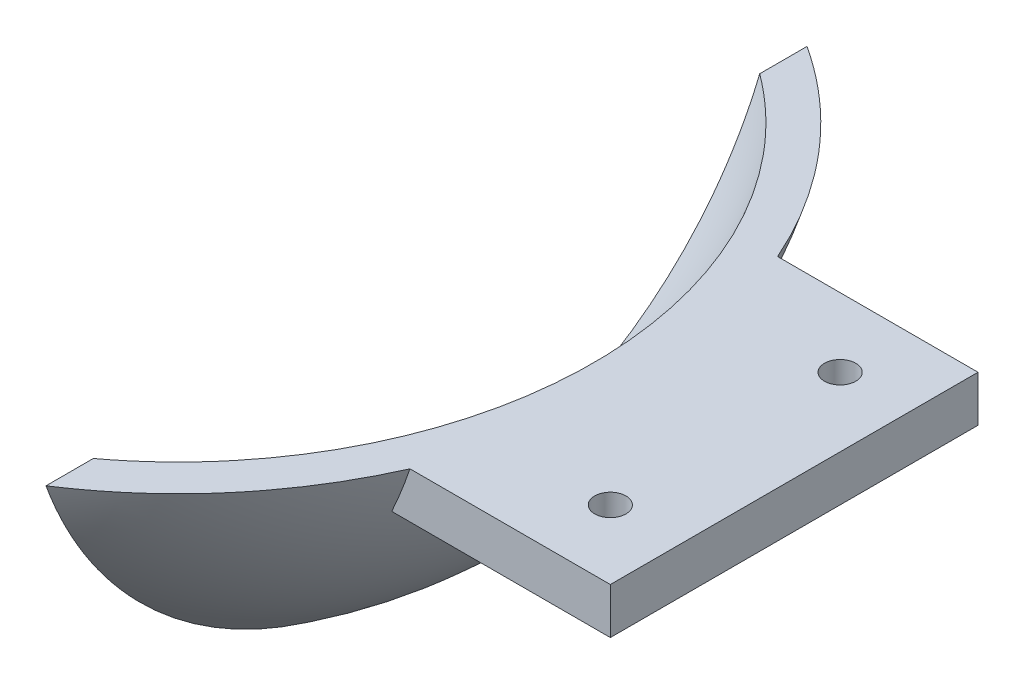
ISO-10303-21;
HEADER;
FILE_DESCRIPTION(('STEP AP214'),'2;1');
FILE_NAME('part.step','',(''),(''),'','','');
FILE_SCHEMA(('AUTOMOTIVE_DESIGN { 1 0 10303 214 1 1 1 1 }'));
ENDSEC;
DATA;
#1=APPLICATION_CONTEXT('core data for automotive mechanical design processes');
#2=APPLICATION_PROTOCOL_DEFINITION('international standard','automotive_design',2000,#1);
#3=PRODUCT_CONTEXT('',#1,'mechanical');
#4=PRODUCT('Part','Part','',(#3));
#5=PRODUCT_RELATED_PRODUCT_CATEGORY('part','',(#4));
#6=PRODUCT_DEFINITION_FORMATION('','',#4);
#7=PRODUCT_DEFINITION_CONTEXT('part definition',#1,'design');
#8=PRODUCT_DEFINITION('design','',#6,#7);
#9=PRODUCT_DEFINITION_SHAPE('','',#8);
#10=(LENGTH_UNIT() NAMED_UNIT(*) SI_UNIT(.MILLI.,.METRE.));
#11=(NAMED_UNIT(*) PLANE_ANGLE_UNIT() SI_UNIT($,.RADIAN.));
#12=(NAMED_UNIT(*) SI_UNIT($,.STERADIAN.) SOLID_ANGLE_UNIT());
#13=UNCERTAINTY_MEASURE_WITH_UNIT(LENGTH_MEASURE(1.E-05),#10,'distance_accuracy_value','');
#14=(GEOMETRIC_REPRESENTATION_CONTEXT(3) GLOBAL_UNCERTAINTY_ASSIGNED_CONTEXT((#13)) GLOBAL_UNIT_ASSIGNED_CONTEXT((#10,
#11,#12)) REPRESENTATION_CONTEXT('',''));
#15=CARTESIAN_POINT('',(0.,0.,0.));
#16=DIRECTION('',(0.,0.,1.));
#17=DIRECTION('',(1.,0.,0.));
#18=AXIS2_PLACEMENT_3D('',#15,#16,#17);
#19=CARTESIAN_POINT('',(52.,-15.,-20.));
#20=DIRECTION('',(0.,-1.,0.));
#21=DIRECTION('',(0.,0.,-1.));
#22=AXIS2_PLACEMENT_3D('',#19,#20,#21);
#23=PLANE('',#22);
#24=CARTESIAN_POINT('',(59.5,-15.,-12.5));
#25=DIRECTION('',(0.,1.,0.));
#26=DIRECTION('',(0.,0.,1.));
#27=AXIS2_PLACEMENT_3D('',#24,#25,#26);
#28=CIRCLE('',#27,1.7);
#29=CARTESIAN_POINT('',(59.5,-15.,-10.8));
#30=VERTEX_POINT('',#29);
#31=EDGE_CURVE('E128',#30,#30,#28,.T.);
#32=ORIENTED_EDGE('',*,*,#31,.F.);
#33=EDGE_LOOP('',(#32));
#34=FACE_BOUND('',#33,.T.);
#35=CARTESIAN_POINT('',(59.5,-15.,12.5));
#36=DIRECTION('',(0.,1.,0.));
#37=DIRECTION('',(0.,0.,1.));
#38=AXIS2_PLACEMENT_3D('',#35,#36,#37);
#39=CIRCLE('',#38,1.7);
#40=CARTESIAN_POINT('',(59.5,-15.,14.2));
#41=VERTEX_POINT('',#40);
#42=EDGE_CURVE('E125',#41,#41,#39,.T.);
#43=ORIENTED_EDGE('',*,*,#42,.F.);
#44=EDGE_LOOP('',(#43));
#45=FACE_BOUND('',#44,.T.);
#46=DIRECTION('',(0.,0.,-1.));
#47=VECTOR('',#46,1.);
#48=CARTESIAN_POINT('',(27.,-15.,-20.));
#49=LINE('',#48,#47);
#50=CARTESIAN_POINT('',(27.,-15.,41.3971315431396));
#51=VERTEX_POINT('',#50);
#52=CARTESIAN_POINT('',(27.,-15.,36.2510775701909));
#53=VERTEX_POINT('',#52);
#54=EDGE_CURVE('E47',#51,#53,#49,.T.);
#55=ORIENTED_EDGE('',*,*,#54,.F.);
#56=CARTESIAN_POINT('',(0.,-15.,0.));
#57=DIRECTION('',(0.,-1.,0.));
#58=DIRECTION('',(0.,0.,-1.));
#59=AXIS2_PLACEMENT_3D('',#56,#57,#58);
#60=CIRCLE('',#59,49.423906158862);
#61=CARTESIAN_POINT('',(45.1964876953951,-15.,20.));
#62=VERTEX_POINT('',#61);
#63=EDGE_CURVE('E68',#62,#51,#60,.T.);
#64=ORIENTED_EDGE('',*,*,#63,.F.);
#65=DIRECTION('',(-1.,0.,0.));
#66=VECTOR('',#65,1.);
#67=CARTESIAN_POINT('',(52.,-15.,20.));
#68=LINE('',#67,#66);
#69=CARTESIAN_POINT('',(67.,-15.,20.));
#70=VERTEX_POINT('',#69);
#71=EDGE_CURVE('E73',#70,#62,#68,.T.);
#72=ORIENTED_EDGE('',*,*,#71,.F.);
#73=DIRECTION('',(0.,0.,1.));
#74=VECTOR('',#73,1.);
#75=CARTESIAN_POINT('',(67.,-15.,-20.));
#76=LINE('',#75,#74);
#77=CARTESIAN_POINT('',(67.,-15.,-20.));
#78=VERTEX_POINT('',#77);
#79=EDGE_CURVE('E104',#78,#70,#76,.T.);
#80=ORIENTED_EDGE('',*,*,#79,.F.);
#81=DIRECTION('',(-1.,0.,0.));
#82=VECTOR('',#81,1.);
#83=CARTESIAN_POINT('',(52.,-15.,-20.));
#84=LINE('',#83,#82);
#85=CARTESIAN_POINT('',(45.1964876953951,-15.,-20.));
#86=VERTEX_POINT('',#85);
#87=EDGE_CURVE('E117',#78,#86,#84,.T.);
#88=ORIENTED_EDGE('',*,*,#87,.T.);
#89=CARTESIAN_POINT('',(27.,-15.,-41.3971315431396));
#90=VERTEX_POINT('',#89);
#91=EDGE_CURVE('E55',#90,#86,#60,.T.);
#92=ORIENTED_EDGE('',*,*,#91,.F.);
#93=CARTESIAN_POINT('',(27.,-15.,-36.2510775701909));
#94=VERTEX_POINT('',#93);
#95=EDGE_CURVE('E92',#94,#90,#49,.T.);
#96=ORIENTED_EDGE('',*,*,#95,.F.);
#97=CARTESIAN_POINT('',(0.,-15.,0.));
#98=DIRECTION('',(0.,-1.,0.));
#99=DIRECTION('',(0.,0.,-1.));
#100=AXIS2_PLACEMENT_3D('',#97,#98,#99);
#101=CIRCLE('',#100,45.2011130947016);
#102=EDGE_CURVE('E40',#53,#94,#101,.F.);
#103=ORIENTED_EDGE('',*,*,#102,.F.);
#104=EDGE_LOOP('',(#55,#64,#72,#80,#88,#92,#96,#103));
#105=FACE_BOUND('',#104,.T.);
#106=ADVANCED_FACE('F33',(#34,#45,#105),#23,.F.);
#107=CARTESIAN_POINT('',(0.,0.,0.));
#108=DIRECTION('',(0.,0.,-1.));
#109=DIRECTION('',(1.,0.,0.));
#110=AXIS2_PLACEMENT_3D('',#107,#108,#109);
#111=SPHERICAL_SURFACE('',#110,51.65);
#112=CARTESIAN_POINT('',(27.,0.,0.));
#113=DIRECTION('',(-1.,0.,0.));
#114=DIRECTION('',(0.,0.,1.));
#115=AXIS2_PLACEMENT_3D('',#112,#113,#114);
#116=CIRCLE('',#115,44.030926631176);
#117=EDGE_CURVE('E134',#90,#51,#116,.T.);
#118=ORIENTED_EDGE('',*,*,#117,.F.);
#119=ORIENTED_EDGE('',*,*,#91,.T.);
#120=CARTESIAN_POINT('',(0.,0.,-20.));
#121=DIRECTION('',(0.,0.,1.));
#122=DIRECTION('',(0.,-1.,0.));
#123=AXIS2_PLACEMENT_3D('',#120,#121,#122);
#124=CIRCLE('',#123,47.6206100338918);
#125=CARTESIAN_POINT('',(43.217155158571,-20.,-20.));
#126=VERTEX_POINT('',#125);
#127=EDGE_CURVE('E107',#126,#86,#124,.T.);
#128=ORIENTED_EDGE('',*,*,#127,.F.);
#129=CARTESIAN_POINT('',(0.,-20.,0.));
#130=DIRECTION('',(0.,-1.,0.));
#131=DIRECTION('',(0.,0.,-1.));
#132=AXIS2_PLACEMENT_3D('',#129,#130,#131);
#133=CIRCLE('',#132,47.6206100338918);
#134=CARTESIAN_POINT('',(43.217155158571,-20.,20.));
#135=VERTEX_POINT('',#134);
#136=EDGE_CURVE('E99',#126,#135,#133,.T.);
#137=ORIENTED_EDGE('',*,*,#136,.T.);
#138=CARTESIAN_POINT('',(0.,0.,20.));
#139=DIRECTION('',(0.,0.,1.));
#140=DIRECTION('',(0.,-1.,0.));
#141=AXIS2_PLACEMENT_3D('',#138,#139,#140);
#142=CIRCLE('',#141,47.6206100338918);
#143=EDGE_CURVE('E110',#135,#62,#142,.T.);
#144=ORIENTED_EDGE('',*,*,#143,.T.);
#145=ORIENTED_EDGE('',*,*,#63,.T.);
#146=EDGE_LOOP('',(#118,#119,#128,#137,#144,#145));
#147=FACE_BOUND('',#146,.T.);
#148=ADVANCED_FACE('F157',(#147),#111,.T.);
#149=CARTESIAN_POINT('',(0.,0.,0.));
#150=DIRECTION('',(0.,0.,-1.));
#151=DIRECTION('',(1.,0.,0.));
#152=AXIS2_PLACEMENT_3D('',#149,#150,#151);
#153=SPHERICAL_SURFACE('',#152,47.625);
#154=ORIENTED_EDGE('',*,*,#102,.T.);
#155=CARTESIAN_POINT('',(27.,0.,0.));
#156=DIRECTION('',(-1.,0.,0.));
#157=DIRECTION('',(0.,0.,1.));
#158=AXIS2_PLACEMENT_3D('',#155,#156,#157);
#159=CIRCLE('',#158,39.231882761346);
#160=EDGE_CURVE('E11',#94,#53,#159,.T.);
#161=ORIENTED_EDGE('',*,*,#160,.T.);
#162=EDGE_LOOP('',(#154,#161));
#163=FACE_BOUND('',#162,.T.);
#164=ADVANCED_FACE('F98',(#163),#153,.F.);
#165=CARTESIAN_POINT('',(52.,-20.,-20.));
#166=DIRECTION('',(0.,-1.,0.));
#167=DIRECTION('',(0.,0.,-1.));
#168=AXIS2_PLACEMENT_3D('',#165,#166,#167);
#169=PLANE('',#168);
#170=CARTESIAN_POINT('',(59.5,-20.,-12.5));
#171=DIRECTION('',(0.,-1.,0.));
#172=DIRECTION('',(0.,0.,-1.));
#173=AXIS2_PLACEMENT_3D('',#170,#171,#172);
#174=CIRCLE('',#173,1.7);
#175=CARTESIAN_POINT('',(59.5,-20.,-14.2));
#176=VERTEX_POINT('',#175);
#177=EDGE_CURVE('E126',#176,#176,#174,.T.);
#178=ORIENTED_EDGE('',*,*,#177,.F.);
#179=EDGE_LOOP('',(#178));
#180=FACE_BOUND('',#179,.T.);
#181=CARTESIAN_POINT('',(59.5,-20.,12.5));
#182=DIRECTION('',(0.,-1.,0.));
#183=DIRECTION('',(0.,0.,-1.));
#184=AXIS2_PLACEMENT_3D('',#181,#182,#183);
#185=CIRCLE('',#184,1.7);
#186=CARTESIAN_POINT('',(59.5,-20.,10.8));
#187=VERTEX_POINT('',#186);
#188=EDGE_CURVE('E122',#187,#187,#185,.T.);
#189=ORIENTED_EDGE('',*,*,#188,.F.);
#190=EDGE_LOOP('',(#189));
#191=FACE_BOUND('',#190,.T.);
#192=ORIENTED_EDGE('',*,*,#136,.F.);
#193=DIRECTION('',(-1.,0.,0.));
#194=VECTOR('',#193,1.);
#195=CARTESIAN_POINT('',(52.,-20.,-20.));
#196=LINE('',#195,#194);
#197=CARTESIAN_POINT('',(67.,-20.,-20.));
#198=VERTEX_POINT('',#197);
#199=EDGE_CURVE('E109',#198,#126,#196,.T.);
#200=ORIENTED_EDGE('',*,*,#199,.F.);
#201=DIRECTION('',(0.,0.,-1.));
#202=VECTOR('',#201,1.);
#203=CARTESIAN_POINT('',(67.,-20.,20.));
#204=LINE('',#203,#202);
#205=CARTESIAN_POINT('',(67.,-20.,20.));
#206=VERTEX_POINT('',#205);
#207=EDGE_CURVE('E142',#206,#198,#204,.T.);
#208=ORIENTED_EDGE('',*,*,#207,.F.);
#209=DIRECTION('',(-1.,0.,0.));
#210=VECTOR('',#209,1.);
#211=CARTESIAN_POINT('',(52.,-20.,20.));
#212=LINE('',#211,#210);
#213=EDGE_CURVE('E116',#206,#135,#212,.T.);
#214=ORIENTED_EDGE('',*,*,#213,.T.);
#215=EDGE_LOOP('',(#192,#200,#208,#214));
#216=FACE_BOUND('',#215,.T.);
#217=ADVANCED_FACE('F154',(#180,#191,#216),#169,.T.);
#218=CARTESIAN_POINT('',(52.,-20.,-20.));
#219=DIRECTION('',(0.,0.,1.));
#220=DIRECTION('',(0.,-1.,0.));
#221=AXIS2_PLACEMENT_3D('',#218,#219,#220);
#222=PLANE('',#221);
#223=ORIENTED_EDGE('',*,*,#199,.T.);
#224=ORIENTED_EDGE('',*,*,#127,.T.);
#225=ORIENTED_EDGE('',*,*,#87,.F.);
#226=DIRECTION('',(0.,1.,0.));
#227=VECTOR('',#226,1.);
#228=CARTESIAN_POINT('',(67.,-20.,-20.));
#229=LINE('',#228,#227);
#230=EDGE_CURVE('E144',#198,#78,#229,.T.);
#231=ORIENTED_EDGE('',*,*,#230,.F.);
#232=EDGE_LOOP('',(#223,#224,#225,#231));
#233=FACE_BOUND('',#232,.T.);
#234=ADVANCED_FACE('F156',(#233),#222,.F.);
#235=CARTESIAN_POINT('',(52.,-20.,20.));
#236=DIRECTION('',(0.,0.,1.));
#237=DIRECTION('',(0.,-1.,0.));
#238=AXIS2_PLACEMENT_3D('',#235,#236,#237);
#239=PLANE('',#238);
#240=ORIENTED_EDGE('',*,*,#143,.F.);
#241=ORIENTED_EDGE('',*,*,#213,.F.);
#242=DIRECTION('',(0.,-1.,0.));
#243=VECTOR('',#242,1.);
#244=CARTESIAN_POINT('',(67.,-15.,20.));
#245=LINE('',#244,#243);
#246=EDGE_CURVE('E124',#70,#206,#245,.T.);
#247=ORIENTED_EDGE('',*,*,#246,.F.);
#248=ORIENTED_EDGE('',*,*,#71,.T.);
#249=EDGE_LOOP('',(#240,#241,#247,#248));
#250=FACE_BOUND('',#249,.T.);
#251=ADVANCED_FACE('F151',(#250),#239,.T.);
#252=CARTESIAN_POINT('',(67.,0.,0.));
#253=DIRECTION('',(1.,0.,0.));
#254=DIRECTION('',(0.,0.,-1.));
#255=AXIS2_PLACEMENT_3D('',#252,#253,#254);
#256=PLANE('',#255);
#257=ORIENTED_EDGE('',*,*,#246,.T.);
#258=ORIENTED_EDGE('',*,*,#207,.T.);
#259=ORIENTED_EDGE('',*,*,#230,.T.);
#260=ORIENTED_EDGE('',*,*,#79,.T.);
#261=EDGE_LOOP('',(#257,#258,#259,#260));
#262=FACE_BOUND('',#261,.T.);
#263=ADVANCED_FACE('F149',(#262),#256,.T.);
#264=CARTESIAN_POINT('',(59.5,-49.423906158862,12.5));
#265=DIRECTION('',(0.,1.,0.));
#266=DIRECTION('',(0.,0.,1.));
#267=AXIS2_PLACEMENT_3D('',#264,#265,#266);
#268=CYLINDRICAL_SURFACE('',#267,1.7);
#269=ORIENTED_EDGE('',*,*,#188,.T.);
#270=EDGE_LOOP('',(#269));
#271=FACE_BOUND('',#270,.T.);
#272=ORIENTED_EDGE('',*,*,#42,.T.);
#273=EDGE_LOOP('',(#272));
#274=FACE_BOUND('',#273,.T.);
#275=ADVANCED_FACE('F177',(#271,#274),#268,.F.);
#276=CARTESIAN_POINT('',(59.5,-49.423906158862,-12.5));
#277=DIRECTION('',(0.,1.,0.));
#278=DIRECTION('',(0.,0.,1.));
#279=AXIS2_PLACEMENT_3D('',#276,#277,#278);
#280=CYLINDRICAL_SURFACE('',#279,1.7);
#281=ORIENTED_EDGE('',*,*,#177,.T.);
#282=EDGE_LOOP('',(#281));
#283=FACE_BOUND('',#282,.T.);
#284=ORIENTED_EDGE('',*,*,#31,.T.);
#285=EDGE_LOOP('',(#284));
#286=FACE_BOUND('',#285,.T.);
#287=ADVANCED_FACE('F181',(#283,#286),#280,.F.);
#288=CARTESIAN_POINT('',(27.,0.,0.));
#289=DIRECTION('',(-1.,0.,0.));
#290=DIRECTION('',(0.,0.,1.));
#291=AXIS2_PLACEMENT_3D('',#288,#289,#290);
#292=PLANE('',#291);
#293=ORIENTED_EDGE('',*,*,#117,.T.);
#294=ORIENTED_EDGE('',*,*,#54,.T.);
#295=ORIENTED_EDGE('',*,*,#160,.F.);
#296=ORIENTED_EDGE('',*,*,#95,.T.);
#297=EDGE_LOOP('',(#293,#294,#295,#296));
#298=FACE_BOUND('',#297,.T.);
#299=ADVANCED_FACE('F91',(#298),#292,.T.);
#300=CLOSED_SHELL('',(#106,#148,#164,#217,#234,#251,#263,#275,#287,#299));
#301=MANIFOLD_SOLID_BREP('B2',#300);
#302=ADVANCED_BREP_SHAPE_REPRESENTATION('',(#18,#301),#14);
#303=SHAPE_DEFINITION_REPRESENTATION(#9,#302);
ENDSEC;
END-ISO-10303-21;
